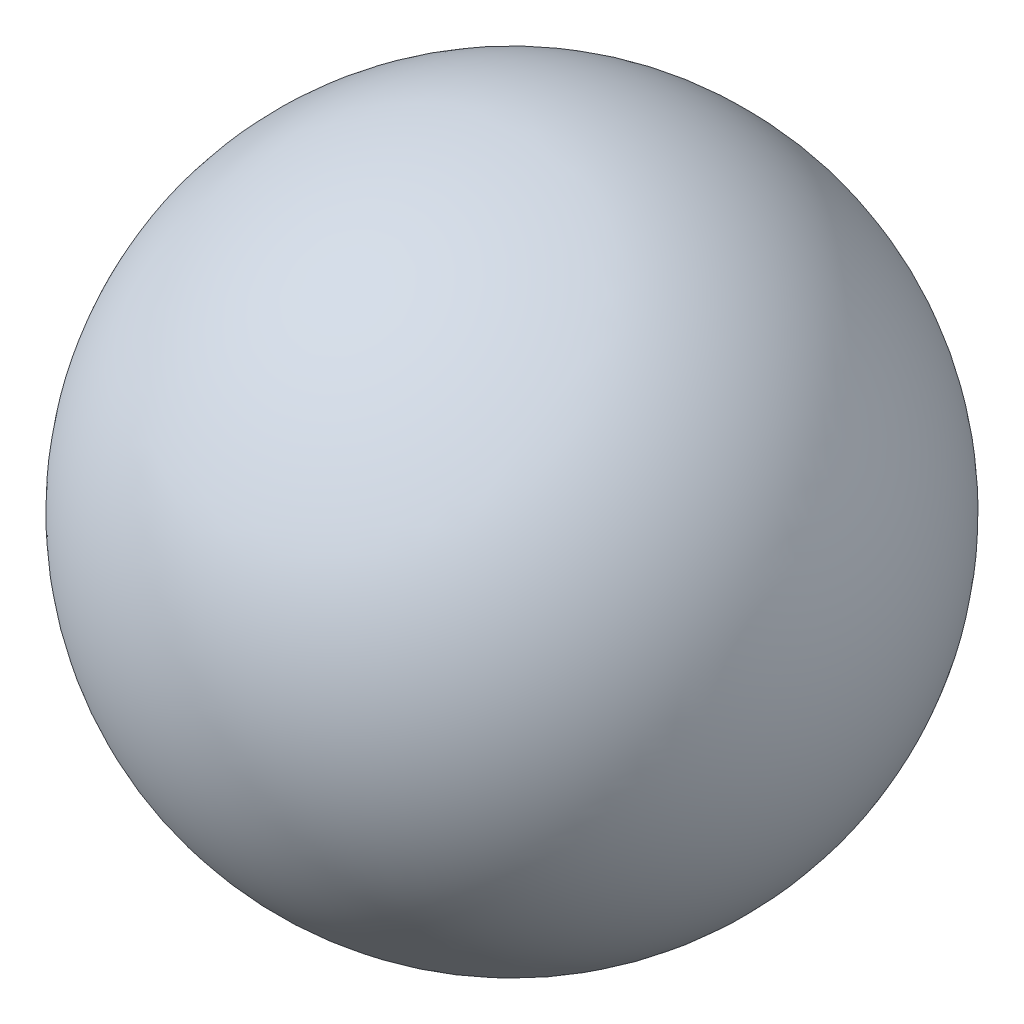
ISO-10303-21;
HEADER;
FILE_DESCRIPTION(('STEP AP214'),'2;1');
FILE_NAME('part.step','',(''),(''),'','','');
FILE_SCHEMA(('AUTOMOTIVE_DESIGN { 1 0 10303 214 1 1 1 1 }'));
ENDSEC;
DATA;
#1=APPLICATION_CONTEXT('core data for automotive mechanical design processes');
#2=APPLICATION_PROTOCOL_DEFINITION('international standard','automotive_design',2000,#1);
#3=PRODUCT_CONTEXT('',#1,'mechanical');
#4=PRODUCT('Part','Part','',(#3));
#5=PRODUCT_RELATED_PRODUCT_CATEGORY('part','',(#4));
#6=PRODUCT_DEFINITION_FORMATION('','',#4);
#7=PRODUCT_DEFINITION_CONTEXT('part definition',#1,'design');
#8=PRODUCT_DEFINITION('design','',#6,#7);
#9=PRODUCT_DEFINITION_SHAPE('','',#8);
#10=(LENGTH_UNIT() NAMED_UNIT(*) SI_UNIT(.MILLI.,.METRE.));
#11=(NAMED_UNIT(*) PLANE_ANGLE_UNIT() SI_UNIT($,.RADIAN.));
#12=(NAMED_UNIT(*) SI_UNIT($,.STERADIAN.) SOLID_ANGLE_UNIT());
#13=UNCERTAINTY_MEASURE_WITH_UNIT(LENGTH_MEASURE(1.E-05),#10,'distance_accuracy_value','');
#14=(GEOMETRIC_REPRESENTATION_CONTEXT(3) GLOBAL_UNCERTAINTY_ASSIGNED_CONTEXT((#13)) GLOBAL_UNIT_ASSIGNED_CONTEXT((#10,
#11,#12)) REPRESENTATION_CONTEXT('',''));
#15=CARTESIAN_POINT('',(0.,0.,0.));
#16=DIRECTION('',(0.,0.,1.));
#17=DIRECTION('',(1.,0.,0.));
#18=AXIS2_PLACEMENT_3D('',#15,#16,#17);
#19=CARTESIAN_POINT('',(0.,0.,0.));
#20=DIRECTION('',(-1.,0.,0.));
#21=DIRECTION('',(0.,1.,0.));
#22=AXIS2_PLACEMENT_3D('',#19,#20,#21);
#23=SPHERICAL_SURFACE('',#22,139.7);
#24=CARTESIAN_POINT('',(-139.7,0.,0.));
#25=VERTEX_POINT('',#24);
#26=VERTEX_LOOP('',#25);
#27=FACE_BOUND('',#26,.T.);
#28=ADVANCED_FACE('F33',(#27),#23,.T.);
#29=CLOSED_SHELL('',(#28));
#30=MANIFOLD_SOLID_BREP('B2',#29);
#31=ADVANCED_BREP_SHAPE_REPRESENTATION('',(#18,#30),#14);
#32=SHAPE_DEFINITION_REPRESENTATION(#9,#31);
ENDSEC;
END-ISO-10303-21;
